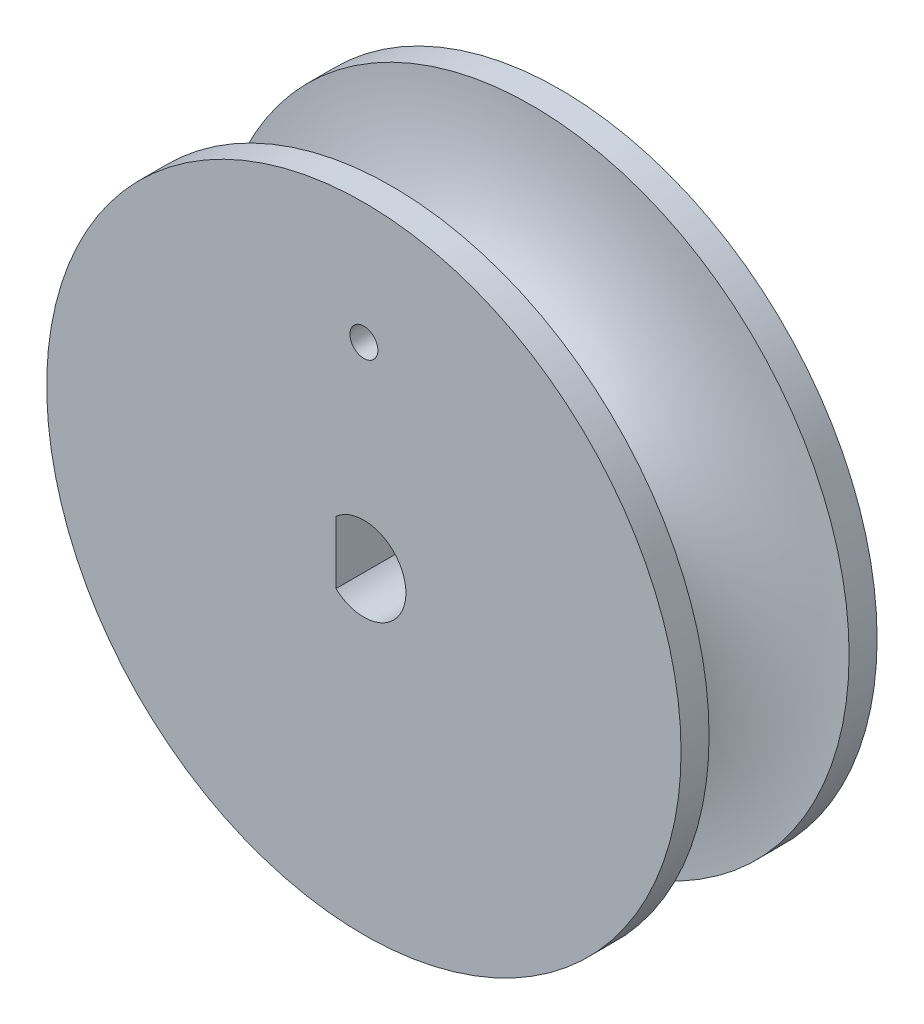
ISO-10303-21;
HEADER;
FILE_DESCRIPTION(('STEP AP214'),'2;1');
FILE_NAME('part.step','',(''),(''),'','','');
FILE_SCHEMA(('AUTOMOTIVE_DESIGN { 1 0 10303 214 1 1 1 1 }'));
ENDSEC;
DATA;
#1=APPLICATION_CONTEXT('core data for automotive mechanical design processes');
#2=APPLICATION_PROTOCOL_DEFINITION('international standard','automotive_design',2000,#1);
#3=PRODUCT_CONTEXT('',#1,'mechanical');
#4=PRODUCT('Part','Part','',(#3));
#5=PRODUCT_RELATED_PRODUCT_CATEGORY('part','',(#4));
#6=PRODUCT_DEFINITION_FORMATION('','',#4);
#7=PRODUCT_DEFINITION_CONTEXT('part definition',#1,'design');
#8=PRODUCT_DEFINITION('design','',#6,#7);
#9=PRODUCT_DEFINITION_SHAPE('','',#8);
#10=(LENGTH_UNIT() NAMED_UNIT(*) SI_UNIT(.MILLI.,.METRE.));
#11=(NAMED_UNIT(*) PLANE_ANGLE_UNIT() SI_UNIT($,.RADIAN.));
#12=(NAMED_UNIT(*) SI_UNIT($,.STERADIAN.) SOLID_ANGLE_UNIT());
#13=UNCERTAINTY_MEASURE_WITH_UNIT(LENGTH_MEASURE(1.E-05),#10,'distance_accuracy_value','');
#14=(GEOMETRIC_REPRESENTATION_CONTEXT(3) GLOBAL_UNCERTAINTY_ASSIGNED_CONTEXT((#13)) GLOBAL_UNIT_ASSIGNED_CONTEXT((#10,
#11,#12)) REPRESENTATION_CONTEXT('',''));
#15=CARTESIAN_POINT('',(0.,0.,0.));
#16=DIRECTION('',(0.,0.,1.));
#17=DIRECTION('',(1.,0.,0.));
#18=AXIS2_PLACEMENT_3D('',#15,#16,#17);
#19=CARTESIAN_POINT('',(0.,11.325,0.));
#20=DIRECTION('',(1.,0.,0.));
#21=DIRECTION('',(0.,-1.,0.));
#22=AXIS2_PLACEMENT_3D('',#19,#20,#21);
#23=ELLIPSE('',#22,5.56017002713572,2.5);
#24=CARTESIAN_POINT('',(0.,0.,0.));
#25=DIRECTION('',(0.,0.,1.));
#26=AXIS1_PLACEMENT('',#24,#25);
#27=SURFACE_OF_REVOLUTION('',#23,#26);
#28=CARTESIAN_POINT('',(0.,7.5,1.81444591573256));
#29=CARTESIAN_POINT('',(0.0265456816365507,7.50000120933849,1.81444624456638));
#30=CARTESIAN_POINT('',(0.0530833408944636,7.49787965646683,1.81360404712751));
#31=CARTESIAN_POINT('',(0.105383814022611,7.4894845929059,1.81025236017423));
#32=CARTESIAN_POINT('',(0.13114672375253,7.48321159810221,1.80774307782264));
#33=CARTESIAN_POINT('',(0.181141912419449,7.46677566916101,1.80110810118963));
#34=CARTESIAN_POINT('',(0.205375873085787,7.45661709893485,1.79698422015072));
#35=CARTESIAN_POINT('',(0.251717228383854,7.43280175438656,1.78719555332039));
#36=CARTESIAN_POINT('',(0.27382433594545,7.41914450874243,1.78153055991254));
#37=CARTESIAN_POINT('',(0.315876457889921,7.38847750961791,1.76861286700515));
#38=CARTESIAN_POINT('',(0.335760104752643,7.37139792052496,1.76132667012994));
#39=CARTESIAN_POINT('',(0.372387770226331,7.33466623379983,1.74536501835066));
#40=CARTESIAN_POINT('',(0.389126938504094,7.31501024008808,1.73668745487128));
#41=CARTESIAN_POINT('',(0.420128353205304,7.27244910859101,1.71750341590283));
#42=CARTESIAN_POINT('',(0.43416543003348,7.24941684464656,1.7069157333289));
#43=CARTESIAN_POINT('',(0.458223621657723,7.20185002251263,1.68451306078783));
#44=CARTESIAN_POINT('',(0.468237031789753,7.17731268488483,1.67269577025603));
#45=CARTESIAN_POINT('',(0.484899131555064,7.12523774209898,1.64695749760634));
#46=CARTESIAN_POINT('',(0.491172595507032,7.09762654055274,1.63294289748202));
#47=CARTESIAN_POINT('',(0.499000320081848,7.04222194503219,1.60397624378407));
#48=CARTESIAN_POINT('',(0.500551347406019,7.01442843928216,1.58902355507739));
#49=CARTESIAN_POINT('',(0.499031932497974,6.95657515729429,1.55693696110669));
#50=CARTESIAN_POINT('',(0.495485094519663,6.92656584863894,1.53973425501799));
#51=CARTESIAN_POINT('',(0.483167567993976,6.86791294559038,1.50495721382886));
#52=CARTESIAN_POINT('',(0.47440124084677,6.83926823250067,1.48738320080408));
#53=CARTESIAN_POINT('',(0.451028906183404,6.78180637452941,1.45093683590899));
#54=CARTESIAN_POINT('',(0.436022999767576,6.75314789103934,1.4320694091934));
#55=CARTESIAN_POINT('',(0.400487771035754,6.69890162699926,1.39511251068662));
#56=CARTESIAN_POINT('',(0.379960510721825,6.67331270524049,1.37702275138739));
#57=CARTESIAN_POINT('',(0.338216440172195,6.63079561855476,1.34602272819232));
#58=CARTESIAN_POINT('',(0.317953564075574,6.61315796986061,1.33279898938845));
#59=CARTESIAN_POINT('',(0.274112964727425,6.5809529397835,1.30812247147662));
#60=CARTESIAN_POINT('',(0.250535120823342,6.56638567019923,1.29666975685924));
#61=CARTESIAN_POINT('',(0.205218556289955,6.5434919155102,1.27836298990939));
#62=CARTESIAN_POINT('',(0.184002079833682,6.53450366542933,1.2710480240525));
#63=CARTESIAN_POINT('',(0.139982265016504,6.5194338877008,1.25866299173076));
#64=CARTESIAN_POINT('',(0.117183187755153,6.51334487709514,1.25358714859416));
#65=CARTESIAN_POINT('',(0.0703417491281413,6.50439527027125,1.24609177004303));
#66=CARTESIAN_POINT('',(0.0462914797679947,6.50155873739404,1.24369203726951));
#67=CARTESIAN_POINT('',(-0.00207546810369232,6.49941926851031,1.24188431415395));
#68=CARTESIAN_POINT('',(-0.0263920432182529,6.50011500641986,1.2424752010742));
#69=CARTESIAN_POINT('',(-0.0719004379064295,6.50472431097814,1.24636103362107));
#70=CARTESIAN_POINT('',(-0.0931535789458767,6.50829458091757,1.24936742666974));
#71=CARTESIAN_POINT('',(-0.134663414475398,6.51800144740914,1.25746168032726));
#72=CARTESIAN_POINT('',(-0.154918495594978,6.52414205603197,1.26255279473002));
#73=CARTESIAN_POINT('',(-0.215839941570812,6.54684298542628,1.28111969496546));
#74=CARTESIAN_POINT('',(-0.254169430522937,6.56739847917259,1.29762528789299));
#75=CARTESIAN_POINT('',(-0.309028949618338,6.60611657912531,1.32745288856244));
#76=CARTESIAN_POINT('',(-0.328145630688213,6.62194680458135,1.3394069671302));
#77=CARTESIAN_POINT('',(-0.363516829253259,6.6558322835199,1.36436177119767));
#78=CARTESIAN_POINT('',(-0.379772789289625,6.67388640773076,1.37736196433837));
#79=CARTESIAN_POINT('',(-0.412445255778118,6.71585394218451,1.4067931846338));
#80=CARTESIAN_POINT('',(-0.428173279117645,6.74020023419243,1.42336975709386));
#81=CARTESIAN_POINT('',(-0.455163285411568,6.79106048408996,1.45687350309073));
#82=CARTESIAN_POINT('',(-0.4664206781148,6.81757663639181,1.47380101829881));
#83=CARTESIAN_POINT('',(-0.485317542621302,6.87549328574213,1.50956839366397));
#84=CARTESIAN_POINT('',(-0.492362769431222,6.90709854017496,1.52839466223399));
#85=CARTESIAN_POINT('',(-0.500230129724863,6.97141342899513,1.56533655474237));
#86=CARTESIAN_POINT('',(-0.501063015323385,7.00412105679437,1.58345335250566));
#87=CARTESIAN_POINT('',(-0.496227190706947,7.06944734896729,1.61840795531484));
#88=CARTESIAN_POINT('',(-0.490606515225986,7.10206488251572,1.63525422792893));
#89=CARTESIAN_POINT('',(-0.472724293746836,7.16625163662109,1.6673685941289));
#90=CARTESIAN_POINT('',(-0.460466453716255,7.19782143176942,1.68263756276769));
#91=CARTESIAN_POINT('',(-0.430734757965693,7.25579696460685,1.70989886175111));
#92=CARTESIAN_POINT('',(-0.413827083453141,7.28241192654525,1.72206222760962));
#93=CARTESIAN_POINT('',(-0.374802449828482,7.33245672826608,1.7444348043594));
#94=CARTESIAN_POINT('',(-0.352689790042882,7.35588917175678,1.75464561551547));
#95=CARTESIAN_POINT('',(-0.306444811378332,7.39614354271138,1.77188136781642));
#96=CARTESIAN_POINT('',(-0.282776312883378,7.41340321007009,1.77912947668513));
#97=CARTESIAN_POINT('',(-0.23240852069184,7.44367589282671,1.79169348111588));
#98=CARTESIAN_POINT('',(-0.205711018002847,7.45669140027897,1.79701051076415));
#99=CARTESIAN_POINT('',(-0.149779887299794,7.47798841786813,1.80564735701836));
#100=CARTESIAN_POINT('',(-0.12051813817227,7.48620711056409,1.80894070034263));
#101=CARTESIAN_POINT('',(-0.0608337792911246,7.49721115385118,1.8133393664659));
#102=CARTESIAN_POINT('',(-0.0304116250543822,7.49999861454118,1.81444553900949));
#103=CARTESIAN_POINT('',(0.,7.5,1.81444591573256));
#104=B_SPLINE_CURVE_WITH_KNOTS('',3,(#28,#29,#30,#31,#32,#33,#34,#35,#36,#37,#38,#39,#40,#41,
#42,#43,#44,#45,#46,#47,#48,#49,#50,#51,#52,#53,#54,#55,#56,#57,#58,#59,#60,#61,#62,#63,#64,#65,
#66,#67,#68,#69,#70,#71,#72,#73,#74,#75,#76,#77,#78,#79,#80,#81,#82,#83,#84,#85,#86,#87,#88,#89,
#90,#91,#92,#93,#94,#95,#96,#97,#98,#99,#100,#101,#102,#103),.UNSPECIFIED.,.T.,.F.,(4,2,2,2,2,2,
2,2,2,2,2,2,2,2,2,2,2,2,2,2,2,2,2,2,2,2,2,2,2,2,2,2,2,2,2,2,2,4),(0.,0.0795265709477247,
0.159043261253689,0.238470906911251,0.317909258249058,0.399173310075153,0.480561699870433,
0.567125120731761,0.653853515434665,0.748240828310011,0.842692750591289,0.9465657031151,
1.05035198107075,1.16218114949641,1.2739686121044,1.36346229686783,1.45295923971365,
1.52519629478593,1.59724588105177,1.66982515233304,1.74237717794363,1.80735968450871,
1.87244400349538,2.00987017054935,2.09231944792718,2.1747270297242,2.27450571178489,
2.3743865790562,2.48622133377675,2.59786248358781,2.70867803023337,2.81943176494706,
2.92025571568379,3.02099667611838,3.11103990231379,3.20103016199112,3.29217389197097,
3.38328220445043),.UNSPECIFIED.);
#105=CARTESIAN_POINT('',(0.,7.5,1.81444591573256));
#106=VERTEX_POINT('',#105);
#107=EDGE_CURVE('E82',#106,#106,#104,.T.);
#108=ORIENTED_EDGE('',*,*,#107,.F.);
#109=EDGE_LOOP('',(#108));
#110=FACE_BOUND('',#109,.T.);
#111=CARTESIAN_POINT('',(0.,0.,-2.5));
#112=DIRECTION('',(0.,0.,1.));
#113=DIRECTION('',(1.,0.,0.));
#114=AXIS2_PLACEMENT_3D('',#111,#112,#113);
#115=CIRCLE('',#114,11.325);
#116=CARTESIAN_POINT('',(11.325,0.,-2.5));
#117=VERTEX_POINT('',#116);
#118=EDGE_CURVE('E103',#117,#117,#115,.T.);
#119=ORIENTED_EDGE('',*,*,#118,.T.);
#120=EDGE_LOOP('',(#119));
#121=FACE_BOUND('',#120,.T.);
#122=CARTESIAN_POINT('',(0.,0.,2.5));
#123=DIRECTION('',(0.,0.,1.));
#124=DIRECTION('',(1.,0.,0.));
#125=AXIS2_PLACEMENT_3D('',#122,#123,#124);
#126=CIRCLE('',#125,11.325);
#127=CARTESIAN_POINT('',(11.325,0.,2.5));
#128=VERTEX_POINT('',#127);
#129=EDGE_CURVE('E11',#128,#128,#126,.T.);
#130=ORIENTED_EDGE('',*,*,#129,.F.);
#131=EDGE_LOOP('',(#130));
#132=FACE_BOUND('',#131,.T.);
#133=ADVANCED_FACE('F45',(#110,#121,#132),#27,.F.);
#134=CARTESIAN_POINT('',(0.,0.,0.));
#135=DIRECTION('',(0.,0.,1.));
#136=DIRECTION('',(1.,0.,0.));
#137=AXIS2_PLACEMENT_3D('',#134,#135,#136);
#138=CYLINDRICAL_SURFACE('',#137,11.325);
#139=ORIENTED_EDGE('',*,*,#129,.T.);
#140=EDGE_LOOP('',(#139));
#141=FACE_BOUND('',#140,.T.);
#142=CARTESIAN_POINT('',(0.,0.,3.5));
#143=DIRECTION('',(0.,0.,1.));
#144=DIRECTION('',(1.,0.,0.));
#145=AXIS2_PLACEMENT_3D('',#142,#143,#144);
#146=CIRCLE('',#145,11.325);
#147=CARTESIAN_POINT('',(11.325,0.,3.5));
#148=VERTEX_POINT('',#147);
#149=EDGE_CURVE('E55',#148,#148,#146,.T.);
#150=ORIENTED_EDGE('',*,*,#149,.F.);
#151=EDGE_LOOP('',(#150));
#152=FACE_BOUND('',#151,.T.);
#153=ADVANCED_FACE('F132',(#141,#152),#138,.T.);
#154=CARTESIAN_POINT('',(0.,0.,3.5));
#155=DIRECTION('',(0.,0.,-1.));
#156=DIRECTION('',(-1.,0.,0.));
#157=AXIS2_PLACEMENT_3D('',#154,#155,#156);
#158=PLANE('',#157);
#159=CARTESIAN_POINT('',(0.,7.,3.5));
#160=DIRECTION('',(0.,0.,1.));
#161=DIRECTION('',(1.,0.,0.));
#162=AXIS2_PLACEMENT_3D('',#159,#160,#161);
#163=CIRCLE('',#162,0.5);
#164=CARTESIAN_POINT('',(0.5,7.,3.5));
#165=VERTEX_POINT('',#164);
#166=EDGE_CURVE('E119',#165,#165,#163,.T.);
#167=ORIENTED_EDGE('',*,*,#166,.F.);
#168=EDGE_LOOP('',(#167));
#169=FACE_BOUND('',#168,.T.);
#170=CARTESIAN_POINT('',(0.,0.,3.5));
#171=DIRECTION('',(0.,0.,1.));
#172=DIRECTION('',(1.,0.,0.));
#173=AXIS2_PLACEMENT_3D('',#170,#171,#172);
#174=CIRCLE('',#173,1.5);
#175=CARTESIAN_POINT('',(-0.999999999999999,-1.11803398874989,3.5));
#176=VERTEX_POINT('',#175);
#177=CARTESIAN_POINT('',(-0.999999999999999,1.11803398874989,3.5));
#178=VERTEX_POINT('',#177);
#179=EDGE_CURVE('E86',#176,#178,#174,.T.);
#180=ORIENTED_EDGE('',*,*,#179,.F.);
#181=DIRECTION('',(0.,1.,0.));
#182=VECTOR('',#181,1.);
#183=CARTESIAN_POINT('',(-0.999999999999999,1.11803398874989,3.5));
#184=LINE('',#183,#182);
#185=EDGE_CURVE('E72',#176,#178,#184,.T.);
#186=ORIENTED_EDGE('',*,*,#185,.T.);
#187=EDGE_LOOP('',(#180,#186));
#188=FACE_BOUND('',#187,.T.);
#189=ORIENTED_EDGE('',*,*,#149,.T.);
#190=EDGE_LOOP('',(#189));
#191=FACE_BOUND('',#190,.T.);
#192=ADVANCED_FACE('F90',(#169,#188,#191),#158,.F.);
#193=CARTESIAN_POINT('',(0.,0.,0.));
#194=DIRECTION('',(0.,0.,1.));
#195=DIRECTION('',(1.,0.,0.));
#196=AXIS2_PLACEMENT_3D('',#193,#194,#195);
#197=CYLINDRICAL_SURFACE('',#196,1.5);
#198=ORIENTED_EDGE('',*,*,#179,.T.);
#199=DIRECTION('',(0.,0.,1.));
#200=VECTOR('',#199,1.);
#201=CARTESIAN_POINT('',(-0.999999999999999,1.11803398874989,-3.5));
#202=LINE('',#201,#200);
#203=CARTESIAN_POINT('',(-0.999999999999999,1.11803398874989,-3.5));
#204=VERTEX_POINT('',#203);
#205=EDGE_CURVE('E77',#204,#178,#202,.T.);
#206=ORIENTED_EDGE('',*,*,#205,.F.);
#207=CARTESIAN_POINT('',(0.,0.,-3.5));
#208=DIRECTION('',(0.,0.,1.));
#209=DIRECTION('',(1.,0.,0.));
#210=AXIS2_PLACEMENT_3D('',#207,#208,#209);
#211=CIRCLE('',#210,1.5);
#212=CARTESIAN_POINT('',(-0.999999999999999,-1.11803398874989,-3.5));
#213=VERTEX_POINT('',#212);
#214=EDGE_CURVE('E87',#213,#204,#211,.T.);
#215=ORIENTED_EDGE('',*,*,#214,.F.);
#216=DIRECTION('',(0.,0.,1.));
#217=VECTOR('',#216,1.);
#218=CARTESIAN_POINT('',(-0.999999999999999,-1.11803398874989,-3.5));
#219=LINE('',#218,#217);
#220=EDGE_CURVE('E75',#213,#176,#219,.T.);
#221=ORIENTED_EDGE('',*,*,#220,.T.);
#222=EDGE_LOOP('',(#198,#206,#215,#221));
#223=FACE_BOUND('',#222,.T.);
#224=ADVANCED_FACE('F85',(#223),#197,.F.);
#225=CARTESIAN_POINT('',(0.,0.,-3.5));
#226=DIRECTION('',(0.,0.,-1.));
#227=DIRECTION('',(-1.,0.,0.));
#228=AXIS2_PLACEMENT_3D('',#225,#226,#227);
#229=PLANE('',#228);
#230=ORIENTED_EDGE('',*,*,#214,.T.);
#231=DIRECTION('',(0.,1.,0.));
#232=VECTOR('',#231,1.);
#233=CARTESIAN_POINT('',(-0.999999999999999,1.11803398874989,-3.5));
#234=LINE('',#233,#232);
#235=EDGE_CURVE('E61',#213,#204,#234,.T.);
#236=ORIENTED_EDGE('',*,*,#235,.F.);
#237=EDGE_LOOP('',(#230,#236));
#238=FACE_BOUND('',#237,.T.);
#239=CARTESIAN_POINT('',(0.,0.,-3.5));
#240=DIRECTION('',(0.,0.,1.));
#241=DIRECTION('',(1.,0.,0.));
#242=AXIS2_PLACEMENT_3D('',#239,#240,#241);
#243=CIRCLE('',#242,11.325);
#244=CARTESIAN_POINT('',(11.325,0.,-3.5));
#245=VERTEX_POINT('',#244);
#246=EDGE_CURVE('E97',#245,#245,#243,.T.);
#247=ORIENTED_EDGE('',*,*,#246,.F.);
#248=EDGE_LOOP('',(#247));
#249=FACE_BOUND('',#248,.T.);
#250=ADVANCED_FACE('F130',(#238,#249),#229,.T.);
#251=ORIENTED_EDGE('',*,*,#246,.T.);
#252=EDGE_LOOP('',(#251));
#253=FACE_BOUND('',#252,.T.);
#254=ORIENTED_EDGE('',*,*,#118,.F.);
#255=EDGE_LOOP('',(#254));
#256=FACE_BOUND('',#255,.T.);
#257=ADVANCED_FACE('F127',(#253,#256),#138,.T.);
#258=CARTESIAN_POINT('',(-0.999999999999999,1.11803398874989,-3.5));
#259=DIRECTION('',(1.,0.,0.));
#260=DIRECTION('',(0.,0.,-1.));
#261=AXIS2_PLACEMENT_3D('',#258,#259,#260);
#262=PLANE('',#261);
#263=ORIENTED_EDGE('',*,*,#185,.F.);
#264=ORIENTED_EDGE('',*,*,#220,.F.);
#265=ORIENTED_EDGE('',*,*,#235,.T.);
#266=ORIENTED_EDGE('',*,*,#205,.T.);
#267=EDGE_LOOP('',(#263,#264,#265,#266));
#268=FACE_BOUND('',#267,.T.);
#269=ADVANCED_FACE('F74',(#268),#262,.T.);
#270=CARTESIAN_POINT('',(0.,7.,0.500000000000002));
#271=DIRECTION('',(0.,0.,1.));
#272=DIRECTION('',(1.,0.,0.));
#273=AXIS2_PLACEMENT_3D('',#270,#271,#272);
#274=CYLINDRICAL_SURFACE('',#273,0.5);
#275=ORIENTED_EDGE('',*,*,#107,.T.);
#276=EDGE_LOOP('',(#275));
#277=FACE_BOUND('',#276,.T.);
#278=ORIENTED_EDGE('',*,*,#166,.T.);
#279=EDGE_LOOP('',(#278));
#280=FACE_BOUND('',#279,.T.);
#281=ADVANCED_FACE('F120',(#277,#280),#274,.F.);
#282=CLOSED_SHELL('',(#133,#153,#192,#224,#250,#257,#269,#281));
#283=MANIFOLD_SOLID_BREP('B2',#282);
#284=ADVANCED_BREP_SHAPE_REPRESENTATION('',(#18,#283),#14);
#285=SHAPE_DEFINITION_REPRESENTATION(#9,#284);
ENDSEC;
END-ISO-10303-21;
